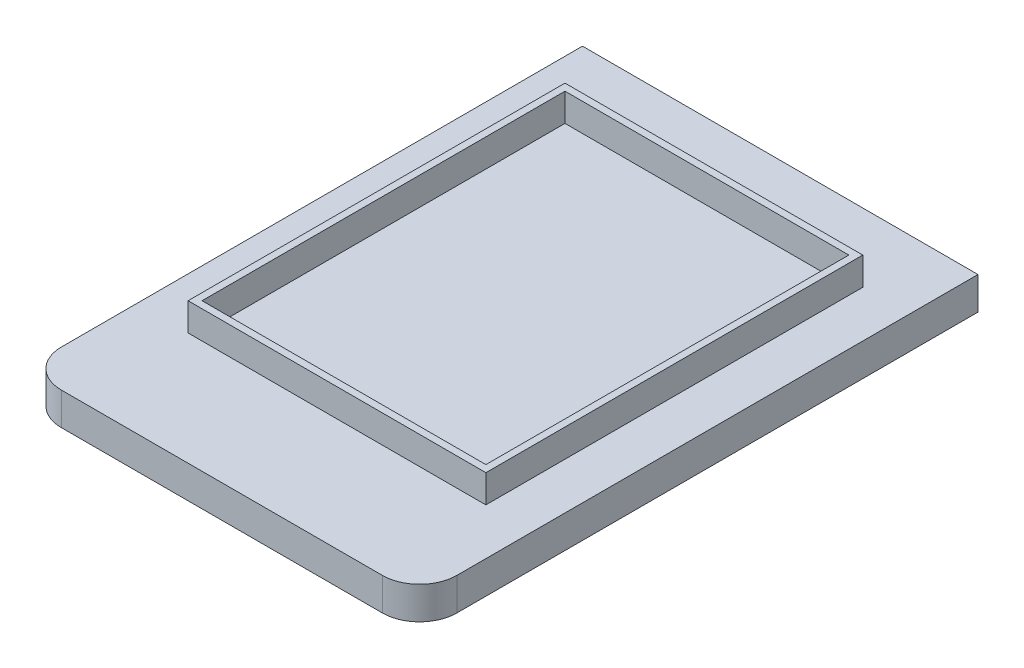
ISO-10303-21;
HEADER;
FILE_DESCRIPTION(('STEP AP214'),'2;1');
FILE_NAME('part.step','',(''),(''),'','','');
FILE_SCHEMA(('AUTOMOTIVE_DESIGN { 1 0 10303 214 1 1 1 1 }'));
ENDSEC;
DATA;
#1=APPLICATION_CONTEXT('core data for automotive mechanical design processes');
#2=APPLICATION_PROTOCOL_DEFINITION('international standard','automotive_design',2000,#1);
#3=PRODUCT_CONTEXT('',#1,'mechanical');
#4=PRODUCT('Part','Part','',(#3));
#5=PRODUCT_RELATED_PRODUCT_CATEGORY('part','',(#4));
#6=PRODUCT_DEFINITION_FORMATION('','',#4);
#7=PRODUCT_DEFINITION_CONTEXT('part definition',#1,'design');
#8=PRODUCT_DEFINITION('design','',#6,#7);
#9=PRODUCT_DEFINITION_SHAPE('','',#8);
#10=(LENGTH_UNIT() NAMED_UNIT(*) SI_UNIT(.MILLI.,.METRE.));
#11=(NAMED_UNIT(*) PLANE_ANGLE_UNIT() SI_UNIT($,.RADIAN.));
#12=(NAMED_UNIT(*) SI_UNIT($,.STERADIAN.) SOLID_ANGLE_UNIT());
#13=UNCERTAINTY_MEASURE_WITH_UNIT(LENGTH_MEASURE(1.E-05),#10,'distance_accuracy_value','');
#14=(GEOMETRIC_REPRESENTATION_CONTEXT(3) GLOBAL_UNCERTAINTY_ASSIGNED_CONTEXT((#13)) GLOBAL_UNIT_ASSIGNED_CONTEXT((#10,
#11,#12)) REPRESENTATION_CONTEXT('',''));
#15=CARTESIAN_POINT('',(0.,0.,0.));
#16=DIRECTION('',(0.,0.,1.));
#17=DIRECTION('',(1.,0.,0.));
#18=AXIS2_PLACEMENT_3D('',#15,#16,#17);
#19=CARTESIAN_POINT('',(0.,7.,0.));
#20=DIRECTION('',(0.,-1.,0.));
#21=DIRECTION('',(0.,0.,-1.));
#22=AXIS2_PLACEMENT_3D('',#19,#20,#21);
#23=PLANE('',#22);
#24=DIRECTION('',(1.,0.,0.));
#25=VECTOR('',#24,1.);
#26=CARTESIAN_POINT('',(0.,7.,0.));
#27=LINE('',#26,#25);
#28=CARTESIAN_POINT('',(8.,7.,0.));
#29=VERTEX_POINT('',#28);
#30=CARTESIAN_POINT('',(77.,7.,0.));
#31=VERTEX_POINT('',#30);
#32=EDGE_CURVE('E237',#29,#31,#27,.T.);
#33=ORIENTED_EDGE('',*,*,#32,.T.);
#34=CARTESIAN_POINT('',(77.,7.,-8.));
#35=DIRECTION('',(0.,-1.,0.));
#36=DIRECTION('',(0.,0.,-1.));
#37=AXIS2_PLACEMENT_3D('',#34,#35,#36);
#38=CIRCLE('',#37,8.);
#39=CARTESIAN_POINT('',(85.,7.,-8.));
#40=VERTEX_POINT('',#39);
#41=EDGE_CURVE('E48',#31,#40,#38,.F.);
#42=ORIENTED_EDGE('',*,*,#41,.T.);
#43=DIRECTION('',(0.,0.,-1.));
#44=VECTOR('',#43,1.);
#45=CARTESIAN_POINT('',(85.,7.,0.));
#46=LINE('',#45,#44);
#47=CARTESIAN_POINT('',(85.,7.,-120.));
#48=VERTEX_POINT('',#47);
#49=EDGE_CURVE('E242',#40,#48,#46,.T.);
#50=ORIENTED_EDGE('',*,*,#49,.T.);
#51=DIRECTION('',(-1.,0.,0.));
#52=VECTOR('',#51,1.);
#53=CARTESIAN_POINT('',(0.,7.,-120.));
#54=LINE('',#53,#52);
#55=CARTESIAN_POINT('',(0.,7.,-120.));
#56=VERTEX_POINT('',#55);
#57=EDGE_CURVE('E245',#48,#56,#54,.T.);
#58=ORIENTED_EDGE('',*,*,#57,.T.);
#59=DIRECTION('',(0.,0.,1.));
#60=VECTOR('',#59,1.);
#61=CARTESIAN_POINT('',(0.,7.,0.));
#62=LINE('',#61,#60);
#63=CARTESIAN_POINT('',(0.,7.,-8.));
#64=VERTEX_POINT('',#63);
#65=EDGE_CURVE('E233',#56,#64,#62,.T.);
#66=ORIENTED_EDGE('',*,*,#65,.T.);
#67=CARTESIAN_POINT('',(8.,7.,-8.));
#68=DIRECTION('',(0.,-1.,0.));
#69=DIRECTION('',(0.,0.,-1.));
#70=AXIS2_PLACEMENT_3D('',#67,#68,#69);
#71=CIRCLE('',#70,8.);
#72=EDGE_CURVE('E285',#64,#29,#71,.F.);
#73=ORIENTED_EDGE('',*,*,#72,.T.);
#74=EDGE_LOOP('',(#33,#42,#50,#58,#66,#73));
#75=FACE_BOUND('',#74,.T.);
#76=DIRECTION('',(0.,0.,1.));
#77=VECTOR('',#76,1.);
#78=CARTESIAN_POINT('',(11.,7.,-105.239607224445));
#79=LINE('',#78,#77);
#80=CARTESIAN_POINT('',(11.,7.,-105.239607224445));
#81=VERTEX_POINT('',#80);
#82=CARTESIAN_POINT('',(11.,7.,-24.2396072244446));
#83=VERTEX_POINT('',#82);
#84=EDGE_CURVE('E159',#81,#83,#79,.T.);
#85=ORIENTED_EDGE('',*,*,#84,.F.);
#86=DIRECTION('',(-1.,0.,0.));
#87=VECTOR('',#86,1.);
#88=CARTESIAN_POINT('',(11.,7.,-105.239607224445));
#89=LINE('',#88,#87);
#90=CARTESIAN_POINT('',(75.,7.,-105.239607224445));
#91=VERTEX_POINT('',#90);
#92=EDGE_CURVE('E198',#91,#81,#89,.T.);
#93=ORIENTED_EDGE('',*,*,#92,.F.);
#94=DIRECTION('',(0.,0.,-1.));
#95=VECTOR('',#94,1.);
#96=CARTESIAN_POINT('',(75.,7.,-105.239607224445));
#97=LINE('',#96,#95);
#98=CARTESIAN_POINT('',(75.,7.,-24.2396072244446));
#99=VERTEX_POINT('',#98);
#100=EDGE_CURVE('E60',#99,#91,#97,.T.);
#101=ORIENTED_EDGE('',*,*,#100,.F.);
#102=DIRECTION('',(1.,0.,0.));
#103=VECTOR('',#102,1.);
#104=CARTESIAN_POINT('',(11.,7.,-24.2396072244446));
#105=LINE('',#104,#103);
#106=EDGE_CURVE('E55',#83,#99,#105,.T.);
#107=ORIENTED_EDGE('',*,*,#106,.F.);
#108=EDGE_LOOP('',(#85,#93,#101,#107));
#109=FACE_BOUND('',#108,.T.);
#110=ADVANCED_FACE('F39',(#75,#109),#23,.F.);
#111=CARTESIAN_POINT('',(0.,7.,0.));
#112=DIRECTION('',(1.,0.,0.));
#113=DIRECTION('',(0.,0.,-1.));
#114=AXIS2_PLACEMENT_3D('',#111,#112,#113);
#115=PLANE('',#114);
#116=DIRECTION('',(0.,0.,1.));
#117=VECTOR('',#116,1.);
#118=CARTESIAN_POINT('',(0.,0.,0.));
#119=LINE('',#118,#117);
#120=CARTESIAN_POINT('',(0.,0.,-120.));
#121=VERTEX_POINT('',#120);
#122=CARTESIAN_POINT('',(0.,0.,-8.));
#123=VERTEX_POINT('',#122);
#124=EDGE_CURVE('E232',#121,#123,#119,.T.);
#125=ORIENTED_EDGE('',*,*,#124,.T.);
#126=DIRECTION('',(0.,-1.,0.));
#127=VECTOR('',#126,1.);
#128=CARTESIAN_POINT('',(0.,7.,-8.));
#129=LINE('',#128,#127);
#130=EDGE_CURVE('E11',#123,#64,#129,.F.);
#131=ORIENTED_EDGE('',*,*,#130,.T.);
#132=ORIENTED_EDGE('',*,*,#65,.F.);
#133=DIRECTION('',(0.,-1.,0.));
#134=VECTOR('',#133,1.);
#135=CARTESIAN_POINT('',(0.,7.,-120.));
#136=LINE('',#135,#134);
#137=EDGE_CURVE('E248',#56,#121,#136,.T.);
#138=ORIENTED_EDGE('',*,*,#137,.T.);
#139=EDGE_LOOP('',(#125,#131,#132,#138));
#140=FACE_BOUND('',#139,.T.);
#141=ADVANCED_FACE('F313',(#140),#115,.F.);
#142=CARTESIAN_POINT('',(0.,7.,0.));
#143=DIRECTION('',(0.,0.,-1.));
#144=DIRECTION('',(-1.,0.,0.));
#145=AXIS2_PLACEMENT_3D('',#142,#143,#144);
#146=PLANE('',#145);
#147=DIRECTION('',(1.,0.,0.));
#148=VECTOR('',#147,1.);
#149=CARTESIAN_POINT('',(0.,0.,0.));
#150=LINE('',#149,#148);
#151=CARTESIAN_POINT('',(8.,0.,0.));
#152=VERTEX_POINT('',#151);
#153=CARTESIAN_POINT('',(77.,0.,0.));
#154=VERTEX_POINT('',#153);
#155=EDGE_CURVE('E252',#152,#154,#150,.T.);
#156=ORIENTED_EDGE('',*,*,#155,.T.);
#157=DIRECTION('',(0.,-1.,0.));
#158=VECTOR('',#157,1.);
#159=CARTESIAN_POINT('',(77.,7.,0.));
#160=LINE('',#159,#158);
#161=EDGE_CURVE('E282',#154,#31,#160,.F.);
#162=ORIENTED_EDGE('',*,*,#161,.T.);
#163=ORIENTED_EDGE('',*,*,#32,.F.);
#164=DIRECTION('',(0.,-1.,0.));
#165=VECTOR('',#164,1.);
#166=CARTESIAN_POINT('',(8.,7.,0.));
#167=LINE('',#166,#165);
#168=EDGE_CURVE('E278',#29,#152,#167,.T.);
#169=ORIENTED_EDGE('',*,*,#168,.T.);
#170=EDGE_LOOP('',(#156,#162,#163,#169));
#171=FACE_BOUND('',#170,.T.);
#172=ADVANCED_FACE('F306',(#171),#146,.F.);
#173=CARTESIAN_POINT('',(85.,7.,0.));
#174=DIRECTION('',(-1.,0.,0.));
#175=DIRECTION('',(0.,0.,1.));
#176=AXIS2_PLACEMENT_3D('',#173,#174,#175);
#177=PLANE('',#176);
#178=ORIENTED_EDGE('',*,*,#49,.F.);
#179=DIRECTION('',(0.,-1.,0.));
#180=VECTOR('',#179,1.);
#181=CARTESIAN_POINT('',(85.,7.,-8.));
#182=LINE('',#181,#180);
#183=CARTESIAN_POINT('',(85.,0.,-8.));
#184=VERTEX_POINT('',#183);
#185=EDGE_CURVE('E268',#40,#184,#182,.T.);
#186=ORIENTED_EDGE('',*,*,#185,.T.);
#187=DIRECTION('',(0.,0.,-1.));
#188=VECTOR('',#187,1.);
#189=CARTESIAN_POINT('',(85.,0.,0.));
#190=LINE('',#189,#188);
#191=CARTESIAN_POINT('',(85.,0.,-120.));
#192=VERTEX_POINT('',#191);
#193=EDGE_CURVE('E256',#184,#192,#190,.T.);
#194=ORIENTED_EDGE('',*,*,#193,.T.);
#195=DIRECTION('',(0.,-1.,0.));
#196=VECTOR('',#195,1.);
#197=CARTESIAN_POINT('',(85.,7.,-120.));
#198=LINE('',#197,#196);
#199=EDGE_CURVE('E264',#48,#192,#198,.T.);
#200=ORIENTED_EDGE('',*,*,#199,.F.);
#201=EDGE_LOOP('',(#178,#186,#194,#200));
#202=FACE_BOUND('',#201,.T.);
#203=ADVANCED_FACE('F297',(#202),#177,.F.);
#204=CARTESIAN_POINT('',(0.,7.,-120.));
#205=DIRECTION('',(0.,0.,1.));
#206=DIRECTION('',(1.,0.,0.));
#207=AXIS2_PLACEMENT_3D('',#204,#205,#206);
#208=PLANE('',#207);
#209=DIRECTION('',(-1.,0.,0.));
#210=VECTOR('',#209,1.);
#211=CARTESIAN_POINT('',(0.,0.,-120.));
#212=LINE('',#211,#210);
#213=EDGE_CURVE('E238',#192,#121,#212,.T.);
#214=ORIENTED_EDGE('',*,*,#213,.T.);
#215=ORIENTED_EDGE('',*,*,#137,.F.);
#216=ORIENTED_EDGE('',*,*,#57,.F.);
#217=ORIENTED_EDGE('',*,*,#199,.T.);
#218=EDGE_LOOP('',(#214,#215,#216,#217));
#219=FACE_BOUND('',#218,.T.);
#220=ADVANCED_FACE('F317',(#219),#208,.F.);
#221=CARTESIAN_POINT('',(0.,0.,0.));
#222=DIRECTION('',(0.,-1.,0.));
#223=DIRECTION('',(0.,0.,-1.));
#224=AXIS2_PLACEMENT_3D('',#221,#222,#223);
#225=PLANE('',#224);
#226=ORIENTED_EDGE('',*,*,#193,.F.);
#227=CARTESIAN_POINT('',(77.,0.,-8.));
#228=DIRECTION('',(0.,-1.,0.));
#229=DIRECTION('',(0.,0.,-1.));
#230=AXIS2_PLACEMENT_3D('',#227,#228,#229);
#231=CIRCLE('',#230,8.);
#232=EDGE_CURVE('E275',#184,#154,#231,.T.);
#233=ORIENTED_EDGE('',*,*,#232,.T.);
#234=ORIENTED_EDGE('',*,*,#155,.F.);
#235=CARTESIAN_POINT('',(8.,0.,-8.));
#236=DIRECTION('',(0.,-1.,0.));
#237=DIRECTION('',(0.,0.,-1.));
#238=AXIS2_PLACEMENT_3D('',#235,#236,#237);
#239=CIRCLE('',#238,8.);
#240=EDGE_CURVE('E272',#152,#123,#239,.T.);
#241=ORIENTED_EDGE('',*,*,#240,.T.);
#242=ORIENTED_EDGE('',*,*,#124,.F.);
#243=ORIENTED_EDGE('',*,*,#213,.F.);
#244=EDGE_LOOP('',(#226,#233,#234,#241,#242,#243));
#245=FACE_BOUND('',#244,.T.);
#246=ADVANCED_FACE('F303',(#245),#225,.T.);
#247=CARTESIAN_POINT('',(77.,7.,-8.));
#248=DIRECTION('',(0.,-1.,0.));
#249=DIRECTION('',(0.,0.,-1.));
#250=AXIS2_PLACEMENT_3D('',#247,#248,#249);
#251=CYLINDRICAL_SURFACE('',#250,8.);
#252=ORIENTED_EDGE('',*,*,#41,.F.);
#253=ORIENTED_EDGE('',*,*,#161,.F.);
#254=ORIENTED_EDGE('',*,*,#232,.F.);
#255=ORIENTED_EDGE('',*,*,#185,.F.);
#256=EDGE_LOOP('',(#252,#253,#254,#255));
#257=FACE_BOUND('',#256,.T.);
#258=ADVANCED_FACE('F300',(#257),#251,.T.);
#259=CARTESIAN_POINT('',(8.,7.,-8.));
#260=DIRECTION('',(0.,-1.,0.));
#261=DIRECTION('',(0.,0.,-1.));
#262=AXIS2_PLACEMENT_3D('',#259,#260,#261);
#263=CYLINDRICAL_SURFACE('',#262,8.);
#264=ORIENTED_EDGE('',*,*,#72,.F.);
#265=ORIENTED_EDGE('',*,*,#130,.F.);
#266=ORIENTED_EDGE('',*,*,#240,.F.);
#267=ORIENTED_EDGE('',*,*,#168,.F.);
#268=EDGE_LOOP('',(#264,#265,#266,#267));
#269=FACE_BOUND('',#268,.T.);
#270=ADVANCED_FACE('F41',(#269),#263,.T.);
#271=CARTESIAN_POINT('',(0.,13.,0.));
#272=DIRECTION('',(0.,1.,0.));
#273=DIRECTION('',(0.,0.,1.));
#274=AXIS2_PLACEMENT_3D('',#271,#272,#273);
#275=PLANE('',#274);
#276=DIRECTION('',(0.,0.,1.));
#277=VECTOR('',#276,1.);
#278=CARTESIAN_POINT('',(11.,13.,-105.239607224445));
#279=LINE('',#278,#277);
#280=CARTESIAN_POINT('',(11.,13.,-105.239607224445));
#281=VERTEX_POINT('',#280);
#282=CARTESIAN_POINT('',(11.,13.,-24.2396072244446));
#283=VERTEX_POINT('',#282);
#284=EDGE_CURVE('E193',#281,#283,#279,.T.);
#285=ORIENTED_EDGE('',*,*,#284,.T.);
#286=DIRECTION('',(1.,0.,0.));
#287=VECTOR('',#286,1.);
#288=CARTESIAN_POINT('',(11.,13.,-24.2396072244446));
#289=LINE('',#288,#287);
#290=CARTESIAN_POINT('',(75.,13.,-24.2396072244446));
#291=VERTEX_POINT('',#290);
#292=EDGE_CURVE('E197',#283,#291,#289,.T.);
#293=ORIENTED_EDGE('',*,*,#292,.T.);
#294=DIRECTION('',(0.,0.,-1.));
#295=VECTOR('',#294,1.);
#296=CARTESIAN_POINT('',(75.,13.,-105.239607224445));
#297=LINE('',#296,#295);
#298=CARTESIAN_POINT('',(75.,13.,-105.239607224445));
#299=VERTEX_POINT('',#298);
#300=EDGE_CURVE('E201',#291,#299,#297,.T.);
#301=ORIENTED_EDGE('',*,*,#300,.T.);
#302=DIRECTION('',(-1.,0.,0.));
#303=VECTOR('',#302,1.);
#304=CARTESIAN_POINT('',(11.,13.,-105.239607224445));
#305=LINE('',#304,#303);
#306=EDGE_CURVE('E204',#299,#281,#305,.T.);
#307=ORIENTED_EDGE('',*,*,#306,.T.);
#308=EDGE_LOOP('',(#285,#293,#301,#307));
#309=FACE_BOUND('',#308,.T.);
#310=DIRECTION('',(1.,0.,0.));
#311=VECTOR('',#310,1.);
#312=CARTESIAN_POINT('',(12.5,13.,-25.7396072244446));
#313=LINE('',#312,#311);
#314=CARTESIAN_POINT('',(12.5,13.,-25.7396072244446));
#315=VERTEX_POINT('',#314);
#316=CARTESIAN_POINT('',(73.5,13.,-25.7396072244446));
#317=VERTEX_POINT('',#316);
#318=EDGE_CURVE('E150',#315,#317,#313,.T.);
#319=ORIENTED_EDGE('',*,*,#318,.F.);
#320=DIRECTION('',(0.,0.,1.));
#321=VECTOR('',#320,1.);
#322=CARTESIAN_POINT('',(12.5,13.,-103.739607224445));
#323=LINE('',#322,#321);
#324=CARTESIAN_POINT('',(12.5,13.,-103.739607224445));
#325=VERTEX_POINT('',#324);
#326=EDGE_CURVE('E139',#325,#315,#323,.T.);
#327=ORIENTED_EDGE('',*,*,#326,.F.);
#328=DIRECTION('',(-1.,0.,0.));
#329=VECTOR('',#328,1.);
#330=CARTESIAN_POINT('',(12.5,13.,-103.739607224445));
#331=LINE('',#330,#329);
#332=CARTESIAN_POINT('',(73.5,13.,-103.739607224445));
#333=VERTEX_POINT('',#332);
#334=EDGE_CURVE('E169',#333,#325,#331,.T.);
#335=ORIENTED_EDGE('',*,*,#334,.F.);
#336=DIRECTION('',(0.,0.,-1.));
#337=VECTOR('',#336,1.);
#338=CARTESIAN_POINT('',(73.5,13.,-103.739607224445));
#339=LINE('',#338,#337);
#340=EDGE_CURVE('E165',#317,#333,#339,.T.);
#341=ORIENTED_EDGE('',*,*,#340,.F.);
#342=EDGE_LOOP('',(#319,#327,#335,#341));
#343=FACE_BOUND('',#342,.T.);
#344=ADVANCED_FACE('F163',(#309,#343),#275,.T.);
#345=CARTESIAN_POINT('',(11.,13.,-105.239607224445));
#346=DIRECTION('',(1.,0.,0.));
#347=DIRECTION('',(0.,0.,-1.));
#348=AXIS2_PLACEMENT_3D('',#345,#346,#347);
#349=PLANE('',#348);
#350=ORIENTED_EDGE('',*,*,#84,.T.);
#351=DIRECTION('',(0.,-1.,0.));
#352=VECTOR('',#351,1.);
#353=CARTESIAN_POINT('',(11.,13.,-24.2396072244446));
#354=LINE('',#353,#352);
#355=EDGE_CURVE('E229',#283,#83,#354,.T.);
#356=ORIENTED_EDGE('',*,*,#355,.F.);
#357=ORIENTED_EDGE('',*,*,#284,.F.);
#358=DIRECTION('',(0.,-1.,0.));
#359=VECTOR('',#358,1.);
#360=CARTESIAN_POINT('',(11.,13.,-105.239607224445));
#361=LINE('',#360,#359);
#362=EDGE_CURVE('E207',#281,#81,#361,.T.);
#363=ORIENTED_EDGE('',*,*,#362,.T.);
#364=EDGE_LOOP('',(#350,#356,#357,#363));
#365=FACE_BOUND('',#364,.T.);
#366=ADVANCED_FACE('F358',(#365),#349,.F.);
#367=CARTESIAN_POINT('',(11.,13.,-24.2396072244446));
#368=DIRECTION('',(0.,0.,-1.));
#369=DIRECTION('',(-1.,0.,0.));
#370=AXIS2_PLACEMENT_3D('',#367,#368,#369);
#371=PLANE('',#370);
#372=ORIENTED_EDGE('',*,*,#106,.T.);
#373=DIRECTION('',(0.,-1.,0.));
#374=VECTOR('',#373,1.);
#375=CARTESIAN_POINT('',(75.,13.,-24.2396072244446));
#376=LINE('',#375,#374);
#377=EDGE_CURVE('E225',#291,#99,#376,.T.);
#378=ORIENTED_EDGE('',*,*,#377,.F.);
#379=ORIENTED_EDGE('',*,*,#292,.F.);
#380=ORIENTED_EDGE('',*,*,#355,.T.);
#381=EDGE_LOOP('',(#372,#378,#379,#380));
#382=FACE_BOUND('',#381,.T.);
#383=ADVANCED_FACE('F366',(#382),#371,.F.);
#384=CARTESIAN_POINT('',(75.,13.,-105.239607224445));
#385=DIRECTION('',(-1.,0.,0.));
#386=DIRECTION('',(0.,0.,1.));
#387=AXIS2_PLACEMENT_3D('',#384,#385,#386);
#388=PLANE('',#387);
#389=ORIENTED_EDGE('',*,*,#100,.T.);
#390=DIRECTION('',(0.,-1.,0.));
#391=VECTOR('',#390,1.);
#392=CARTESIAN_POINT('',(75.,13.,-105.239607224445));
#393=LINE('',#392,#391);
#394=EDGE_CURVE('E221',#299,#91,#393,.T.);
#395=ORIENTED_EDGE('',*,*,#394,.F.);
#396=ORIENTED_EDGE('',*,*,#300,.F.);
#397=ORIENTED_EDGE('',*,*,#377,.T.);
#398=EDGE_LOOP('',(#389,#395,#396,#397));
#399=FACE_BOUND('',#398,.T.);
#400=ADVANCED_FACE('F362',(#399),#388,.F.);
#401=CARTESIAN_POINT('',(11.,13.,-105.239607224445));
#402=DIRECTION('',(0.,0.,1.));
#403=DIRECTION('',(1.,0.,0.));
#404=AXIS2_PLACEMENT_3D('',#401,#402,#403);
#405=PLANE('',#404);
#406=ORIENTED_EDGE('',*,*,#92,.T.);
#407=ORIENTED_EDGE('',*,*,#362,.F.);
#408=ORIENTED_EDGE('',*,*,#306,.F.);
#409=ORIENTED_EDGE('',*,*,#394,.T.);
#410=EDGE_LOOP('',(#406,#407,#408,#409));
#411=FACE_BOUND('',#410,.T.);
#412=ADVANCED_FACE('F355',(#411),#405,.F.);
#413=CARTESIAN_POINT('',(12.5,13.,-103.739607224445));
#414=DIRECTION('',(1.,0.,0.));
#415=DIRECTION('',(0.,0.,-1.));
#416=AXIS2_PLACEMENT_3D('',#413,#414,#415);
#417=PLANE('',#416);
#418=DIRECTION('',(0.,0.,1.));
#419=VECTOR('',#418,1.);
#420=CARTESIAN_POINT('',(12.5,7.,-103.739607224445));
#421=LINE('',#420,#419);
#422=CARTESIAN_POINT('',(12.5,7.,-103.739607224445));
#423=VERTEX_POINT('',#422);
#424=CARTESIAN_POINT('',(12.5,7.,-25.7396072244446));
#425=VERTEX_POINT('',#424);
#426=EDGE_CURVE('E174',#423,#425,#421,.T.);
#427=ORIENTED_EDGE('',*,*,#426,.F.);
#428=DIRECTION('',(0.,-1.,0.));
#429=VECTOR('',#428,1.);
#430=CARTESIAN_POINT('',(12.5,13.,-103.739607224445));
#431=LINE('',#430,#429);
#432=EDGE_CURVE('E145',#325,#423,#431,.T.);
#433=ORIENTED_EDGE('',*,*,#432,.F.);
#434=ORIENTED_EDGE('',*,*,#326,.T.);
#435=DIRECTION('',(0.,-1.,0.));
#436=VECTOR('',#435,1.);
#437=CARTESIAN_POINT('',(12.5,13.,-25.7396072244446));
#438=LINE('',#437,#436);
#439=EDGE_CURVE('E143',#315,#425,#438,.T.);
#440=ORIENTED_EDGE('',*,*,#439,.T.);
#441=EDGE_LOOP('',(#427,#433,#434,#440));
#442=FACE_BOUND('',#441,.T.);
#443=ADVANCED_FACE('F142',(#442),#417,.T.);
#444=CARTESIAN_POINT('',(12.5,13.,-25.7396072244446));
#445=DIRECTION('',(0.,0.,-1.));
#446=DIRECTION('',(-1.,0.,0.));
#447=AXIS2_PLACEMENT_3D('',#444,#445,#446);
#448=PLANE('',#447);
#449=DIRECTION('',(1.,0.,0.));
#450=VECTOR('',#449,1.);
#451=CARTESIAN_POINT('',(12.5,7.,-25.7396072244446));
#452=LINE('',#451,#450);
#453=CARTESIAN_POINT('',(73.5,7.,-25.7396072244446));
#454=VERTEX_POINT('',#453);
#455=EDGE_CURVE('E157',#425,#454,#452,.T.);
#456=ORIENTED_EDGE('',*,*,#455,.F.);
#457=ORIENTED_EDGE('',*,*,#439,.F.);
#458=ORIENTED_EDGE('',*,*,#318,.T.);
#459=DIRECTION('',(0.,-1.,0.));
#460=VECTOR('',#459,1.);
#461=CARTESIAN_POINT('',(73.5,13.,-25.7396072244446));
#462=LINE('',#461,#460);
#463=EDGE_CURVE('E160',#317,#454,#462,.T.);
#464=ORIENTED_EDGE('',*,*,#463,.T.);
#465=EDGE_LOOP('',(#456,#457,#458,#464));
#466=FACE_BOUND('',#465,.T.);
#467=ADVANCED_FACE('F154',(#466),#448,.T.);
#468=CARTESIAN_POINT('',(73.5,13.,-103.739607224445));
#469=DIRECTION('',(-1.,0.,0.));
#470=DIRECTION('',(0.,0.,1.));
#471=AXIS2_PLACEMENT_3D('',#468,#469,#470);
#472=PLANE('',#471);
#473=DIRECTION('',(0.,0.,-1.));
#474=VECTOR('',#473,1.);
#475=CARTESIAN_POINT('',(73.5,7.,-103.739607224445));
#476=LINE('',#475,#474);
#477=CARTESIAN_POINT('',(73.5,7.,-103.739607224445));
#478=VERTEX_POINT('',#477);
#479=EDGE_CURVE('E179',#454,#478,#476,.T.);
#480=ORIENTED_EDGE('',*,*,#479,.F.);
#481=ORIENTED_EDGE('',*,*,#463,.F.);
#482=ORIENTED_EDGE('',*,*,#340,.T.);
#483=DIRECTION('',(0.,-1.,0.));
#484=VECTOR('',#483,1.);
#485=CARTESIAN_POINT('',(73.5,13.,-103.739607224445));
#486=LINE('',#485,#484);
#487=EDGE_CURVE('E188',#333,#478,#486,.T.);
#488=ORIENTED_EDGE('',*,*,#487,.T.);
#489=EDGE_LOOP('',(#480,#481,#482,#488));
#490=FACE_BOUND('',#489,.T.);
#491=ADVANCED_FACE('F340',(#490),#472,.T.);
#492=CARTESIAN_POINT('',(12.5,13.,-103.739607224445));
#493=DIRECTION('',(0.,0.,1.));
#494=DIRECTION('',(1.,0.,0.));
#495=AXIS2_PLACEMENT_3D('',#492,#493,#494);
#496=PLANE('',#495);
#497=DIRECTION('',(-1.,0.,0.));
#498=VECTOR('',#497,1.);
#499=CARTESIAN_POINT('',(12.5,7.,-103.739607224445));
#500=LINE('',#499,#498);
#501=EDGE_CURVE('E151',#478,#423,#500,.T.);
#502=ORIENTED_EDGE('',*,*,#501,.F.);
#503=ORIENTED_EDGE('',*,*,#487,.F.);
#504=ORIENTED_EDGE('',*,*,#334,.T.);
#505=ORIENTED_EDGE('',*,*,#432,.T.);
#506=EDGE_LOOP('',(#502,#503,#504,#505));
#507=FACE_BOUND('',#506,.T.);
#508=ADVANCED_FACE('F335',(#507),#496,.T.);
#509=ORIENTED_EDGE('',*,*,#501,.T.);
#510=ORIENTED_EDGE('',*,*,#426,.T.);
#511=ORIENTED_EDGE('',*,*,#455,.T.);
#512=ORIENTED_EDGE('',*,*,#479,.T.);
#513=EDGE_LOOP('',(#509,#510,#511,#512));
#514=FACE_BOUND('',#513,.T.);
#515=ADVANCED_FACE('F328',(#514),#23,.F.);
#516=CLOSED_SHELL('',(#110,#141,#172,#203,#220,#246,#258,#270,#344,#366,#383,#400,#412,#443,
#467,#491,#508,#515));
#517=MANIFOLD_SOLID_BREP('B2',#516);
#518=ADVANCED_BREP_SHAPE_REPRESENTATION('',(#18,#517),#14);
#519=SHAPE_DEFINITION_REPRESENTATION(#9,#518);
ENDSEC;
END-ISO-10303-21;
